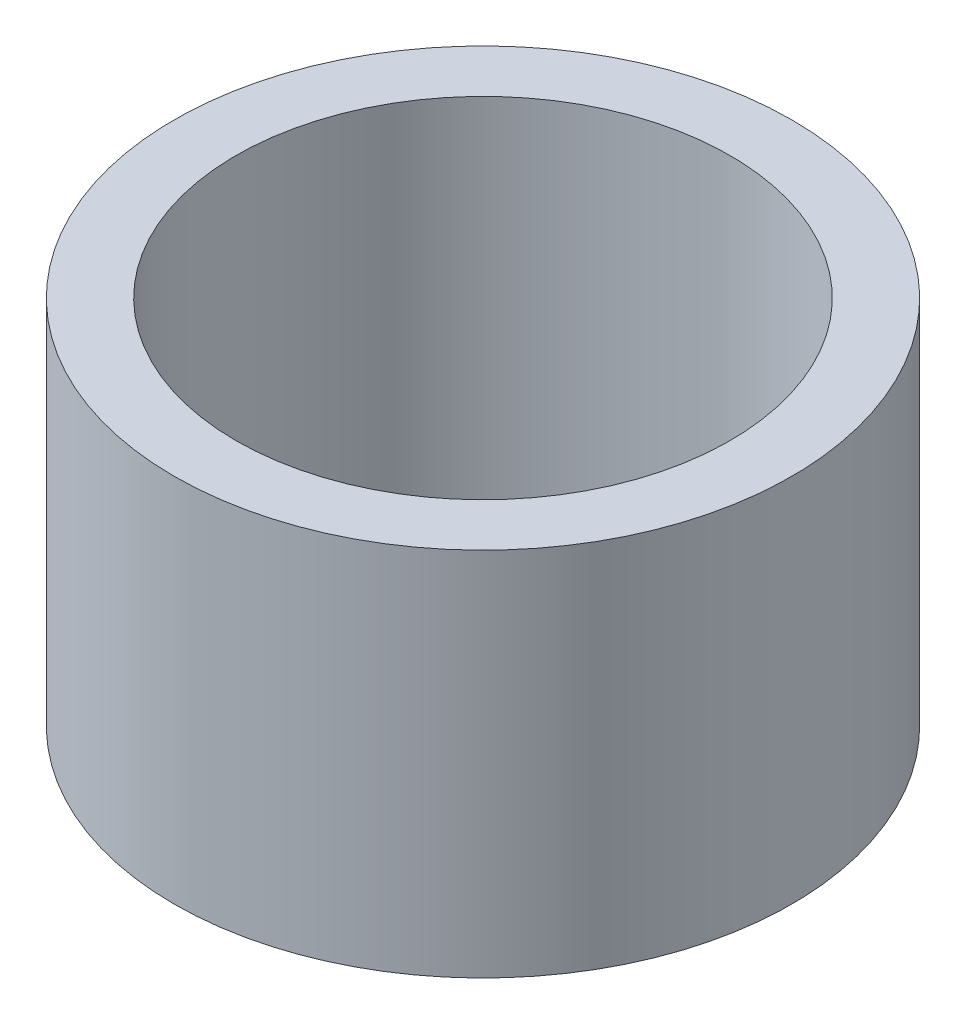
ISO-10303-21;
HEADER;
FILE_DESCRIPTION(('STEP AP214'),'2;1');
FILE_NAME('part.step','',(''),(''),'','','');
FILE_SCHEMA(('AUTOMOTIVE_DESIGN { 1 0 10303 214 1 1 1 1 }'));
ENDSEC;
DATA;
#1=APPLICATION_CONTEXT('core data for automotive mechanical design processes');
#2=APPLICATION_PROTOCOL_DEFINITION('international standard','automotive_design',2000,#1);
#3=PRODUCT_CONTEXT('',#1,'mechanical');
#4=PRODUCT('Part','Part','',(#3));
#5=PRODUCT_RELATED_PRODUCT_CATEGORY('part','',(#4));
#6=PRODUCT_DEFINITION_FORMATION('','',#4);
#7=PRODUCT_DEFINITION_CONTEXT('part definition',#1,'design');
#8=PRODUCT_DEFINITION('design','',#6,#7);
#9=PRODUCT_DEFINITION_SHAPE('','',#8);
#10=(LENGTH_UNIT() NAMED_UNIT(*) SI_UNIT(.MILLI.,.METRE.));
#11=(NAMED_UNIT(*) PLANE_ANGLE_UNIT() SI_UNIT($,.RADIAN.));
#12=(NAMED_UNIT(*) SI_UNIT($,.STERADIAN.) SOLID_ANGLE_UNIT());
#13=UNCERTAINTY_MEASURE_WITH_UNIT(LENGTH_MEASURE(1.E-05),#10,'distance_accuracy_value','');
#14=(GEOMETRIC_REPRESENTATION_CONTEXT(3) GLOBAL_UNCERTAINTY_ASSIGNED_CONTEXT((#13)) GLOBAL_UNIT_ASSIGNED_CONTEXT((#10,
#11,#12)) REPRESENTATION_CONTEXT('',''));
#15=CARTESIAN_POINT('',(0.,0.,0.));
#16=DIRECTION('',(0.,0.,1.));
#17=DIRECTION('',(1.,0.,0.));
#18=AXIS2_PLACEMENT_3D('',#15,#16,#17);
#19=CARTESIAN_POINT('',(0.,6.,0.));
#20=DIRECTION('',(0.,1.,0.));
#21=DIRECTION('',(0.,0.,1.));
#22=AXIS2_PLACEMENT_3D('',#19,#20,#21);
#23=PLANE('',#22);
#24=CARTESIAN_POINT('',(0.,6.,0.));
#25=DIRECTION('',(0.,1.,0.));
#26=DIRECTION('',(0.,0.,1.));
#27=AXIS2_PLACEMENT_3D('',#24,#25,#26);
#28=CIRCLE('',#27,5.);
#29=CARTESIAN_POINT('',(0.,6.,5.));
#30=VERTEX_POINT('',#29);
#31=EDGE_CURVE('E10',#30,#30,#28,.T.);
#32=ORIENTED_EDGE('',*,*,#31,.T.);
#33=EDGE_LOOP('',(#32));
#34=FACE_BOUND('',#33,.T.);
#35=CARTESIAN_POINT('',(0.,6.,0.));
#36=DIRECTION('',(0.,1.,0.));
#37=DIRECTION('',(0.,0.,1.));
#38=AXIS2_PLACEMENT_3D('',#35,#36,#37);
#39=CIRCLE('',#38,4.);
#40=CARTESIAN_POINT('',(0.,6.,4.));
#41=VERTEX_POINT('',#40);
#42=EDGE_CURVE('E41',#41,#41,#39,.T.);
#43=ORIENTED_EDGE('',*,*,#42,.F.);
#44=EDGE_LOOP('',(#43));
#45=FACE_BOUND('',#44,.T.);
#46=ADVANCED_FACE('F30',(#34,#45),#23,.T.);
#47=CARTESIAN_POINT('',(0.,0.,0.));
#48=DIRECTION('',(0.,1.,0.));
#49=DIRECTION('',(0.,0.,1.));
#50=AXIS2_PLACEMENT_3D('',#47,#48,#49);
#51=PLANE('',#50);
#52=CARTESIAN_POINT('',(0.,0.,0.));
#53=DIRECTION('',(0.,1.,0.));
#54=DIRECTION('',(0.,0.,1.));
#55=AXIS2_PLACEMENT_3D('',#52,#53,#54);
#56=CIRCLE('',#55,5.);
#57=CARTESIAN_POINT('',(0.,0.,5.));
#58=VERTEX_POINT('',#57);
#59=EDGE_CURVE('E34',#58,#58,#56,.T.);
#60=ORIENTED_EDGE('',*,*,#59,.F.);
#61=EDGE_LOOP('',(#60));
#62=FACE_BOUND('',#61,.T.);
#63=CARTESIAN_POINT('',(0.,0.,0.));
#64=DIRECTION('',(0.,1.,0.));
#65=DIRECTION('',(0.,0.,1.));
#66=AXIS2_PLACEMENT_3D('',#63,#64,#65);
#67=CIRCLE('',#66,4.);
#68=CARTESIAN_POINT('',(0.,0.,4.));
#69=VERTEX_POINT('',#68);
#70=EDGE_CURVE('E43',#69,#69,#67,.T.);
#71=ORIENTED_EDGE('',*,*,#70,.T.);
#72=EDGE_LOOP('',(#71));
#73=FACE_BOUND('',#72,.T.);
#74=ADVANCED_FACE('F53',(#62,#73),#51,.F.);
#75=CARTESIAN_POINT('',(0.,6.,0.));
#76=DIRECTION('',(0.,-1.,0.));
#77=DIRECTION('',(0.,0.,-1.));
#78=AXIS2_PLACEMENT_3D('',#75,#76,#77);
#79=CYLINDRICAL_SURFACE('',#78,5.);
#80=ORIENTED_EDGE('',*,*,#31,.F.);
#81=EDGE_LOOP('',(#80));
#82=FACE_BOUND('',#81,.T.);
#83=ORIENTED_EDGE('',*,*,#59,.T.);
#84=EDGE_LOOP('',(#83));
#85=FACE_BOUND('',#84,.T.);
#86=ADVANCED_FACE('F32',(#82,#85),#79,.T.);
#87=CARTESIAN_POINT('',(0.,6.,0.));
#88=DIRECTION('',(0.,-1.,0.));
#89=DIRECTION('',(0.,0.,-1.));
#90=AXIS2_PLACEMENT_3D('',#87,#88,#89);
#91=CYLINDRICAL_SURFACE('',#90,4.);
#92=ORIENTED_EDGE('',*,*,#42,.T.);
#93=EDGE_LOOP('',(#92));
#94=FACE_BOUND('',#93,.T.);
#95=ORIENTED_EDGE('',*,*,#70,.F.);
#96=EDGE_LOOP('',(#95));
#97=FACE_BOUND('',#96,.T.);
#98=ADVANCED_FACE('F49',(#94,#97),#91,.F.);
#99=CLOSED_SHELL('',(#46,#74,#86,#98));
#100=MANIFOLD_SOLID_BREP('B2',#99);
#101=ADVANCED_BREP_SHAPE_REPRESENTATION('',(#18,#100),#14);
#102=SHAPE_DEFINITION_REPRESENTATION(#9,#101);
ENDSEC;
END-ISO-10303-21;
